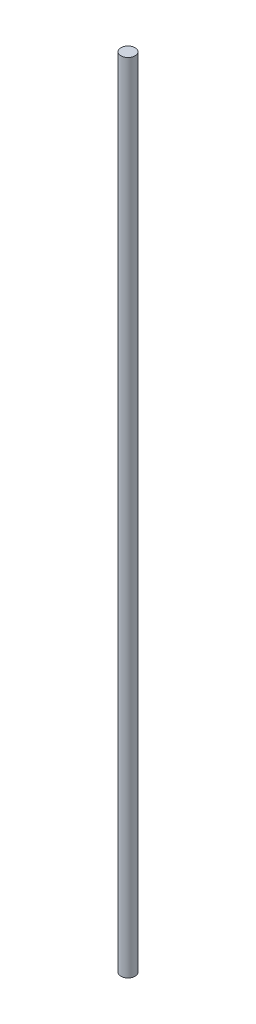
ISO-10303-21;
HEADER;
FILE_DESCRIPTION(('STEP AP214'),'2;1');
FILE_NAME('part.step','',(''),(''),'','','');
FILE_SCHEMA(('AUTOMOTIVE_DESIGN { 1 0 10303 214 1 1 1 1 }'));
ENDSEC;
DATA;
#1=APPLICATION_CONTEXT('core data for automotive mechanical design processes');
#2=APPLICATION_PROTOCOL_DEFINITION('international standard','automotive_design',2000,#1);
#3=PRODUCT_CONTEXT('',#1,'mechanical');
#4=PRODUCT('Part','Part','',(#3));
#5=PRODUCT_RELATED_PRODUCT_CATEGORY('part','',(#4));
#6=PRODUCT_DEFINITION_FORMATION('','',#4);
#7=PRODUCT_DEFINITION_CONTEXT('part definition',#1,'design');
#8=PRODUCT_DEFINITION('design','',#6,#7);
#9=PRODUCT_DEFINITION_SHAPE('','',#8);
#10=(LENGTH_UNIT() NAMED_UNIT(*) SI_UNIT(.MILLI.,.METRE.));
#11=(NAMED_UNIT(*) PLANE_ANGLE_UNIT() SI_UNIT($,.RADIAN.));
#12=(NAMED_UNIT(*) SI_UNIT($,.STERADIAN.) SOLID_ANGLE_UNIT());
#13=UNCERTAINTY_MEASURE_WITH_UNIT(LENGTH_MEASURE(1.E-05),#10,'distance_accuracy_value','');
#14=(GEOMETRIC_REPRESENTATION_CONTEXT(3) GLOBAL_UNCERTAINTY_ASSIGNED_CONTEXT((#13)) GLOBAL_UNIT_ASSIGNED_CONTEXT((#10,
#11,#12)) REPRESENTATION_CONTEXT('',''));
#15=CARTESIAN_POINT('',(0.,0.,0.));
#16=DIRECTION('',(0.,0.,1.));
#17=DIRECTION('',(1.,0.,0.));
#18=AXIS2_PLACEMENT_3D('',#15,#16,#17);
#19=CARTESIAN_POINT('',(0.,-170.,0.));
#20=DIRECTION('',(0.,1.,0.));
#21=DIRECTION('',(0.,0.,1.));
#22=AXIS2_PLACEMENT_3D('',#19,#20,#21);
#23=CYLINDRICAL_SURFACE('',#22,3.);
#24=CARTESIAN_POINT('',(0.,-170.,0.));
#25=DIRECTION('',(0.,1.,0.));
#26=DIRECTION('',(0.,0.,1.));
#27=AXIS2_PLACEMENT_3D('',#24,#25,#26);
#28=CIRCLE('',#27,3.);
#29=CARTESIAN_POINT('',(0.,-170.,3.));
#30=VERTEX_POINT('',#29);
#31=EDGE_CURVE('E10',#30,#30,#28,.T.);
#32=ORIENTED_EDGE('',*,*,#31,.T.);
#33=EDGE_LOOP('',(#32));
#34=FACE_BOUND('',#33,.T.);
#35=CARTESIAN_POINT('',(0.,170.,0.));
#36=DIRECTION('',(0.,1.,0.));
#37=DIRECTION('',(0.,0.,1.));
#38=AXIS2_PLACEMENT_3D('',#35,#36,#37);
#39=CIRCLE('',#38,3.);
#40=CARTESIAN_POINT('',(0.,170.,3.));
#41=VERTEX_POINT('',#40);
#42=EDGE_CURVE('E50',#41,#41,#39,.T.);
#43=ORIENTED_EDGE('',*,*,#42,.F.);
#44=EDGE_LOOP('',(#43));
#45=FACE_BOUND('',#44,.T.);
#46=ADVANCED_FACE('F43',(#34,#45),#23,.T.);
#47=CARTESIAN_POINT('',(0.,-170.,0.));
#48=DIRECTION('',(0.,1.,0.));
#49=DIRECTION('',(0.,0.,1.));
#50=AXIS2_PLACEMENT_3D('',#47,#48,#49);
#51=PLANE('',#50);
#52=ORIENTED_EDGE('',*,*,#31,.F.);
#53=EDGE_LOOP('',(#52));
#54=FACE_BOUND('',#53,.T.);
#55=ADVANCED_FACE('F60',(#54),#51,.F.);
#56=CARTESIAN_POINT('',(0.,170.,0.));
#57=DIRECTION('',(0.,1.,0.));
#58=DIRECTION('',(0.,0.,1.));
#59=AXIS2_PLACEMENT_3D('',#56,#57,#58);
#60=PLANE('',#59);
#61=ORIENTED_EDGE('',*,*,#42,.T.);
#62=EDGE_LOOP('',(#61));
#63=FACE_BOUND('',#62,.T.);
#64=ADVANCED_FACE('F57',(#63),#60,.T.);
#65=CLOSED_SHELL('',(#46,#55,#64));
#66=MANIFOLD_SOLID_BREP('B2',#65);
#67=ADVANCED_BREP_SHAPE_REPRESENTATION('',(#18,#66),#14);
#68=SHAPE_DEFINITION_REPRESENTATION(#9,#67);
ENDSEC;
END-ISO-10303-21;
